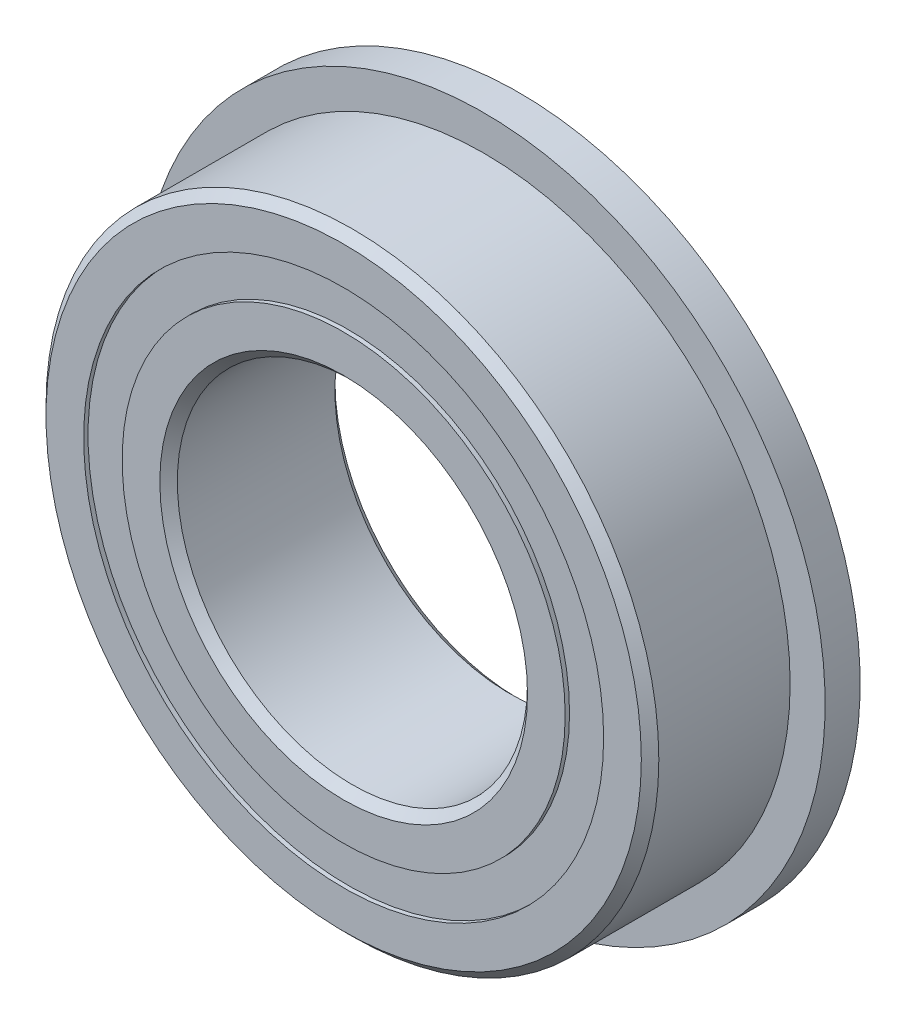
ISO-10303-21;
HEADER;
FILE_DESCRIPTION(('STEP AP214'),'2;1');
FILE_NAME('part.step','',(''),(''),'','','');
FILE_SCHEMA(('AUTOMOTIVE_DESIGN { 1 0 10303 214 1 1 1 1 }'));
ENDSEC;
DATA;
#1=APPLICATION_CONTEXT('core data for automotive mechanical design processes');
#2=APPLICATION_PROTOCOL_DEFINITION('international standard','automotive_design',2000,#1);
#3=PRODUCT_CONTEXT('',#1,'mechanical');
#4=PRODUCT('Part','Part','',(#3));
#5=PRODUCT_RELATED_PRODUCT_CATEGORY('part','',(#4));
#6=PRODUCT_DEFINITION_FORMATION('','',#4);
#7=PRODUCT_DEFINITION_CONTEXT('part definition',#1,'design');
#8=PRODUCT_DEFINITION('design','',#6,#7);
#9=PRODUCT_DEFINITION_SHAPE('','',#8);
#10=(LENGTH_UNIT() NAMED_UNIT(*) SI_UNIT(.MILLI.,.METRE.));
#11=(NAMED_UNIT(*) PLANE_ANGLE_UNIT() SI_UNIT($,.RADIAN.));
#12=(NAMED_UNIT(*) SI_UNIT($,.STERADIAN.) SOLID_ANGLE_UNIT());
#13=UNCERTAINTY_MEASURE_WITH_UNIT(LENGTH_MEASURE(1.E-05),#10,'distance_accuracy_value','');
#14=(GEOMETRIC_REPRESENTATION_CONTEXT(3) GLOBAL_UNCERTAINTY_ASSIGNED_CONTEXT((#13)) GLOBAL_UNIT_ASSIGNED_CONTEXT((#10,
#11,#12)) REPRESENTATION_CONTEXT('',''));
#15=CARTESIAN_POINT('',(0.,0.,0.));
#16=DIRECTION('',(0.,0.,1.));
#17=DIRECTION('',(1.,0.,0.));
#18=AXIS2_PLACEMENT_3D('',#15,#16,#17);
#19=CARTESIAN_POINT('',(0.,5.93956043956044,-1.9));
#20=DIRECTION('',(0.,0.,1.));
#21=DIRECTION('',(1.,0.,0.));
#22=AXIS2_PLACEMENT_3D('',#19,#20,#21);
#23=PLANE('',#22);
#24=CARTESIAN_POINT('',(0.,0.,-1.9));
#25=DIRECTION('',(0.,0.,1.));
#26=DIRECTION('',(1.,0.,0.));
#27=AXIS2_PLACEMENT_3D('',#24,#25,#26);
#28=CIRCLE('',#27,5.93956043956044);
#29=CARTESIAN_POINT('',(5.93956043956044,0.,-1.9));
#30=VERTEX_POINT('',#29);
#31=EDGE_CURVE('E62',#30,#30,#28,.T.);
#32=ORIENTED_EDGE('',*,*,#31,.F.);
#33=EDGE_LOOP('',(#32));
#34=FACE_BOUND('',#33,.T.);
#35=CARTESIAN_POINT('',(0.,0.,-1.9));
#36=DIRECTION('',(0.,0.,1.));
#37=DIRECTION('',(1.,0.,0.));
#38=AXIS2_PLACEMENT_3D('',#35,#36,#37);
#39=CIRCLE('',#38,5.06043956043956);
#40=CARTESIAN_POINT('',(5.06043956043956,0.,-1.9));
#41=VERTEX_POINT('',#40);
#42=EDGE_CURVE('E11',#41,#41,#39,.T.);
#43=ORIENTED_EDGE('',*,*,#42,.T.);
#44=EDGE_LOOP('',(#43));
#45=FACE_BOUND('',#44,.T.);
#46=ADVANCED_FACE('F48',(#34,#45),#23,.F.);
#47=CARTESIAN_POINT('',(0.,0.,2.));
#48=DIRECTION('',(0.,0.,1.));
#49=DIRECTION('',(1.,0.,0.));
#50=AXIS2_PLACEMENT_3D('',#47,#48,#49);
#51=CYLINDRICAL_SURFACE('',#50,5.06043956043956);
#52=ORIENTED_EDGE('',*,*,#42,.F.);
#53=EDGE_LOOP('',(#52));
#54=FACE_BOUND('',#53,.T.);
#55=CARTESIAN_POINT('',(0.,0.,-0.991633418565898));
#56=DIRECTION('',(0.,0.,1.));
#57=DIRECTION('',(1.,0.,0.));
#58=AXIS2_PLACEMENT_3D('',#55,#56,#57);
#59=CIRCLE('',#58,5.06043956043956);
#60=CARTESIAN_POINT('',(5.06043956043956,0.,-0.991633418565898));
#61=VERTEX_POINT('',#60);
#62=EDGE_CURVE('E54',#61,#61,#59,.T.);
#63=ORIENTED_EDGE('',*,*,#62,.T.);
#64=EDGE_LOOP('',(#63));
#65=FACE_BOUND('',#64,.T.);
#66=ADVANCED_FACE('F71',(#54,#65),#51,.F.);
#67=CARTESIAN_POINT('',(0.,5.93956043956044,-0.991633418565898));
#68=DIRECTION('',(0.,0.,-1.));
#69=DIRECTION('',(-1.,0.,0.));
#70=AXIS2_PLACEMENT_3D('',#67,#68,#69);
#71=PLANE('',#70);
#72=ORIENTED_EDGE('',*,*,#62,.F.);
#73=EDGE_LOOP('',(#72));
#74=FACE_BOUND('',#73,.T.);
#75=CARTESIAN_POINT('',(0.,0.,-0.991633418565898));
#76=DIRECTION('',(0.,0.,1.));
#77=DIRECTION('',(1.,0.,0.));
#78=AXIS2_PLACEMENT_3D('',#75,#76,#77);
#79=CIRCLE('',#78,5.93956043956044);
#80=CARTESIAN_POINT('',(5.93956043956044,0.,-0.991633418565898));
#81=VERTEX_POINT('',#80);
#82=EDGE_CURVE('E58',#81,#81,#79,.T.);
#83=ORIENTED_EDGE('',*,*,#82,.T.);
#84=EDGE_LOOP('',(#83));
#85=FACE_BOUND('',#84,.T.);
#86=ADVANCED_FACE('F75',(#74,#85),#71,.F.);
#87=CARTESIAN_POINT('',(0.,0.,2.));
#88=DIRECTION('',(0.,0.,1.));
#89=DIRECTION('',(1.,0.,0.));
#90=AXIS2_PLACEMENT_3D('',#87,#88,#89);
#91=CYLINDRICAL_SURFACE('',#90,5.93956043956044);
#92=ORIENTED_EDGE('',*,*,#82,.F.);
#93=EDGE_LOOP('',(#92));
#94=FACE_BOUND('',#93,.T.);
#95=ORIENTED_EDGE('',*,*,#31,.T.);
#96=EDGE_LOOP('',(#95));
#97=FACE_BOUND('',#96,.T.);
#98=ADVANCED_FACE('F68',(#94,#97),#91,.T.);
#99=CLOSED_SHELL('',(#46,#66,#86,#98));
#100=MANIFOLD_SOLID_BREP('B2',#99);
#101=CARTESIAN_POINT('',(0.,5.93956043956044,1.9));
#102=DIRECTION('',(0.,0.,-1.));
#103=DIRECTION('',(-1.,0.,0.));
#104=AXIS2_PLACEMENT_3D('',#101,#102,#103);
#105=PLANE('',#104);
#106=CARTESIAN_POINT('',(0.,0.,1.9));
#107=DIRECTION('',(0.,0.,1.));
#108=DIRECTION('',(1.,0.,0.));
#109=AXIS2_PLACEMENT_3D('',#106,#107,#108);
#110=CIRCLE('',#109,5.06043956043956);
#111=CARTESIAN_POINT('',(5.06043956043956,0.,1.9));
#112=VERTEX_POINT('',#111);
#113=EDGE_CURVE('E47',#112,#112,#110,.T.);
#114=ORIENTED_EDGE('',*,*,#113,.F.);
#115=EDGE_LOOP('',(#114));
#116=FACE_BOUND('',#115,.T.);
#117=CARTESIAN_POINT('',(0.,0.,1.9));
#118=DIRECTION('',(0.,0.,1.));
#119=DIRECTION('',(1.,0.,0.));
#120=AXIS2_PLACEMENT_3D('',#117,#118,#119);
#121=CIRCLE('',#120,5.93956043956044);
#122=CARTESIAN_POINT('',(5.93956043956044,0.,1.9));
#123=VERTEX_POINT('',#122);
#124=EDGE_CURVE('E130',#123,#123,#121,.T.);
#125=ORIENTED_EDGE('',*,*,#124,.T.);
#126=EDGE_LOOP('',(#125));
#127=FACE_BOUND('',#126,.T.);
#128=ADVANCED_FACE('F116',(#116,#127),#105,.F.);
#129=CARTESIAN_POINT('',(0.,0.,2.));
#130=DIRECTION('',(0.,0.,1.));
#131=DIRECTION('',(1.,0.,0.));
#132=AXIS2_PLACEMENT_3D('',#129,#130,#131);
#133=CYLINDRICAL_SURFACE('',#132,5.06043956043956);
#134=CARTESIAN_POINT('',(0.,0.,0.991633418565898));
#135=DIRECTION('',(0.,0.,1.));
#136=DIRECTION('',(1.,0.,0.));
#137=AXIS2_PLACEMENT_3D('',#134,#135,#136);
#138=CIRCLE('',#137,5.06043956043956);
#139=CARTESIAN_POINT('',(5.06043956043956,0.,0.991633418565898));
#140=VERTEX_POINT('',#139);
#141=EDGE_CURVE('E122',#140,#140,#138,.T.);
#142=ORIENTED_EDGE('',*,*,#141,.F.);
#143=EDGE_LOOP('',(#142));
#144=FACE_BOUND('',#143,.T.);
#145=ORIENTED_EDGE('',*,*,#113,.T.);
#146=EDGE_LOOP('',(#145));
#147=FACE_BOUND('',#146,.T.);
#148=ADVANCED_FACE('F145',(#144,#147),#133,.F.);
#149=CARTESIAN_POINT('',(0.,5.93956043956044,0.991633418565898));
#150=DIRECTION('',(0.,0.,1.));
#151=DIRECTION('',(1.,0.,0.));
#152=AXIS2_PLACEMENT_3D('',#149,#150,#151);
#153=PLANE('',#152);
#154=CARTESIAN_POINT('',(0.,0.,0.991633418565898));
#155=DIRECTION('',(0.,0.,1.));
#156=DIRECTION('',(1.,0.,0.));
#157=AXIS2_PLACEMENT_3D('',#154,#155,#156);
#158=CIRCLE('',#157,5.93956043956044);
#159=CARTESIAN_POINT('',(5.93956043956044,0.,0.991633418565898));
#160=VERTEX_POINT('',#159);
#161=EDGE_CURVE('E126',#160,#160,#158,.T.);
#162=ORIENTED_EDGE('',*,*,#161,.F.);
#163=EDGE_LOOP('',(#162));
#164=FACE_BOUND('',#163,.T.);
#165=ORIENTED_EDGE('',*,*,#141,.T.);
#166=EDGE_LOOP('',(#165));
#167=FACE_BOUND('',#166,.T.);
#168=ADVANCED_FACE('F140',(#164,#167),#153,.F.);
#169=CARTESIAN_POINT('',(0.,0.,2.));
#170=DIRECTION('',(0.,0.,1.));
#171=DIRECTION('',(1.,0.,0.));
#172=AXIS2_PLACEMENT_3D('',#169,#170,#171);
#173=CYLINDRICAL_SURFACE('',#172,5.93956043956044);
#174=ORIENTED_EDGE('',*,*,#124,.F.);
#175=EDGE_LOOP('',(#174));
#176=FACE_BOUND('',#175,.T.);
#177=ORIENTED_EDGE('',*,*,#161,.T.);
#178=EDGE_LOOP('',(#177));
#179=FACE_BOUND('',#178,.T.);
#180=ADVANCED_FACE('F137',(#176,#179),#173,.T.);
#181=CLOSED_SHELL('',(#128,#148,#168,#180));
#182=MANIFOLD_SOLID_BREP('B6',#181);
#183=CARTESIAN_POINT('',(-2.74999999999994,4.76313972081445,0.));
#184=DIRECTION('',(0.,0.,1.));
#185=DIRECTION('',(-0.499999999999989,0.866025403784445,0.));
#186=AXIS2_PLACEMENT_3D('',#183,#184,#185);
#187=SPHERICAL_SURFACE('',#186,0.991633418565898);
#188=CARTESIAN_POINT('',(-2.74999999999994,4.76313972081445,0.991633418565898));
#189=VERTEX_POINT('',#188);
#190=VERTEX_LOOP('',#189);
#191=FACE_BOUND('',#190,.T.);
#192=ADVANCED_FACE('F184',(#191),#187,.T.);
#193=CLOSED_SHELL('',(#192));
#194=MANIFOLD_SOLID_BREP('B42',#193);
#195=CARTESIAN_POINT('',(-4.76313972081438,2.75000000000006,0.));
#196=DIRECTION('',(0.,0.,1.));
#197=DIRECTION('',(-0.866025403784433,0.50000000000001,0.));
#198=AXIS2_PLACEMENT_3D('',#195,#196,#197);
#199=SPHERICAL_SURFACE('',#198,0.991633418565898);
#200=CARTESIAN_POINT('',(-4.76313972081438,2.75000000000006,0.991633418565898));
#201=VERTEX_POINT('',#200);
#202=VERTEX_LOOP('',#201);
#203=FACE_BOUND('',#202,.T.);
#204=ADVANCED_FACE('F205',(#203),#199,.T.);
#205=CLOSED_SHELL('',(#204));
#206=MANIFOLD_SOLID_BREP('B112',#205);
#207=CARTESIAN_POINT('',(-5.5,0.,0.));
#208=DIRECTION('',(0.,0.,1.));
#209=DIRECTION('',(-1.,0.,0.));
#210=AXIS2_PLACEMENT_3D('',#207,#208,#209);
#211=SPHERICAL_SURFACE('',#210,0.991633418565898);
#212=CARTESIAN_POINT('',(-5.5,0.,0.991633418565898));
#213=VERTEX_POINT('',#212);
#214=VERTEX_LOOP('',#213);
#215=FACE_BOUND('',#214,.T.);
#216=ADVANCED_FACE('F226',(#215),#211,.T.);
#217=CLOSED_SHELL('',(#216));
#218=MANIFOLD_SOLID_BREP('B180',#217);
#219=CARTESIAN_POINT('',(-4.76313972081444,-2.74999999999996,0.));
#220=DIRECTION('',(0.,0.,1.));
#221=DIRECTION('',(-0.866025403784443,-0.499999999999992,0.));
#222=AXIS2_PLACEMENT_3D('',#219,#220,#221);
#223=SPHERICAL_SURFACE('',#222,0.991633418565898);
#224=CARTESIAN_POINT('',(-4.76313972081444,-2.74999999999996,0.991633418565898));
#225=VERTEX_POINT('',#224);
#226=VERTEX_LOOP('',#225);
#227=FACE_BOUND('',#226,.T.);
#228=ADVANCED_FACE('F247',(#227),#223,.T.);
#229=CLOSED_SHELL('',(#228));
#230=MANIFOLD_SOLID_BREP('B201',#229);
#231=CARTESIAN_POINT('',(-2.75000000000004,-4.76313972081439,0.));
#232=DIRECTION('',(0.,0.,1.));
#233=DIRECTION('',(-0.500000000000007,-0.866025403784435,0.));
#234=AXIS2_PLACEMENT_3D('',#231,#232,#233);
#235=SPHERICAL_SURFACE('',#234,0.991633418565898);
#236=CARTESIAN_POINT('',(-2.75000000000004,-4.76313972081439,0.991633418565898));
#237=VERTEX_POINT('',#236);
#238=VERTEX_LOOP('',#237);
#239=FACE_BOUND('',#238,.T.);
#240=ADVANCED_FACE('F268',(#239),#235,.T.);
#241=CLOSED_SHELL('',(#240));
#242=MANIFOLD_SOLID_BREP('B222',#241);
#243=CARTESIAN_POINT('',(0.,-5.5,0.));
#244=DIRECTION('',(0.,0.,1.));
#245=DIRECTION('',(0.,-1.,0.));
#246=AXIS2_PLACEMENT_3D('',#243,#244,#245);
#247=SPHERICAL_SURFACE('',#246,0.991633418565898);
#248=CARTESIAN_POINT('',(0.,-5.5,0.991633418565898));
#249=VERTEX_POINT('',#248);
#250=VERTEX_LOOP('',#249);
#251=FACE_BOUND('',#250,.T.);
#252=ADVANCED_FACE('F289',(#251),#247,.T.);
#253=CLOSED_SHELL('',(#252));
#254=MANIFOLD_SOLID_BREP('B243',#253);
#255=CARTESIAN_POINT('',(2.74999999999997,-4.76313972081443,0.));
#256=DIRECTION('',(0.,0.,1.));
#257=DIRECTION('',(0.499999999999995,-0.866025403784442,0.));
#258=AXIS2_PLACEMENT_3D('',#255,#256,#257);
#259=SPHERICAL_SURFACE('',#258,0.991633418565898);
#260=CARTESIAN_POINT('',(2.74999999999997,-4.76313972081443,0.991633418565898));
#261=VERTEX_POINT('',#260);
#262=VERTEX_LOOP('',#261);
#263=FACE_BOUND('',#262,.T.);
#264=ADVANCED_FACE('F310',(#263),#259,.T.);
#265=CLOSED_SHELL('',(#264));
#266=MANIFOLD_SOLID_BREP('B264',#265);
#267=CARTESIAN_POINT('',(4.7631397208144,-2.75000000000002,0.));
#268=DIRECTION('',(0.,0.,1.));
#269=DIRECTION('',(0.866025403784436,-0.500000000000004,0.));
#270=AXIS2_PLACEMENT_3D('',#267,#268,#269);
#271=SPHERICAL_SURFACE('',#270,0.991633418565898);
#272=CARTESIAN_POINT('',(4.7631397208144,-2.75000000000002,0.991633418565898));
#273=VERTEX_POINT('',#272);
#274=VERTEX_LOOP('',#273);
#275=FACE_BOUND('',#274,.T.);
#276=ADVANCED_FACE('F331',(#275),#271,.T.);
#277=CLOSED_SHELL('',(#276));
#278=MANIFOLD_SOLID_BREP('B285',#277);
#279=CARTESIAN_POINT('',(5.5,0.,0.));
#280=DIRECTION('',(0.,0.,1.));
#281=DIRECTION('',(1.,0.,0.));
#282=AXIS2_PLACEMENT_3D('',#279,#280,#281);
#283=SPHERICAL_SURFACE('',#282,0.991633418565898);
#284=CARTESIAN_POINT('',(5.5,0.,0.991633418565898));
#285=VERTEX_POINT('',#284);
#286=VERTEX_LOOP('',#285);
#287=FACE_BOUND('',#286,.T.);
#288=ADVANCED_FACE('F352',(#287),#283,.T.);
#289=CLOSED_SHELL('',(#288));
#290=MANIFOLD_SOLID_BREP('B306',#289);
#291=CARTESIAN_POINT('',(4.76313972081442,2.74999999999999,0.));
#292=DIRECTION('',(0.,0.,1.));
#293=DIRECTION('',(0.86602540378444,0.499999999999998,0.));
#294=AXIS2_PLACEMENT_3D('',#291,#292,#293);
#295=SPHERICAL_SURFACE('',#294,0.991633418565898);
#296=CARTESIAN_POINT('',(4.76313972081442,2.74999999999999,0.991633418565898));
#297=VERTEX_POINT('',#296);
#298=VERTEX_LOOP('',#297);
#299=FACE_BOUND('',#298,.T.);
#300=ADVANCED_FACE('F373',(#299),#295,.T.);
#301=CLOSED_SHELL('',(#300));
#302=MANIFOLD_SOLID_BREP('B327',#301);
#303=CARTESIAN_POINT('',(2.75000000000001,4.76313972081441,0.));
#304=DIRECTION('',(0.,0.,1.));
#305=DIRECTION('',(0.500000000000001,0.866025403784438,0.));
#306=AXIS2_PLACEMENT_3D('',#303,#304,#305);
#307=SPHERICAL_SURFACE('',#306,0.991633418565898);
#308=CARTESIAN_POINT('',(2.75000000000001,4.76313972081441,0.991633418565898));
#309=VERTEX_POINT('',#308);
#310=VERTEX_LOOP('',#309);
#311=FACE_BOUND('',#310,.T.);
#312=ADVANCED_FACE('F394',(#311),#307,.T.);
#313=CLOSED_SHELL('',(#312));
#314=MANIFOLD_SOLID_BREP('B348',#313);
#315=CARTESIAN_POINT('',(0.,5.5,0.));
#316=DIRECTION('',(0.,0.,1.));
#317=DIRECTION('',(0.,1.,0.));
#318=AXIS2_PLACEMENT_3D('',#315,#316,#317);
#319=SPHERICAL_SURFACE('',#318,0.991633418565898);
#320=CARTESIAN_POINT('',(0.,5.5,0.991633418565898));
#321=VERTEX_POINT('',#320);
#322=VERTEX_LOOP('',#321);
#323=FACE_BOUND('',#322,.T.);
#324=ADVANCED_FACE('F417',(#323),#319,.T.);
#325=CLOSED_SHELL('',(#324));
#326=MANIFOLD_SOLID_BREP('B369',#325);
#327=CARTESIAN_POINT('',(0.,5.06043956043956,2.));
#328=DIRECTION('',(0.,0.,-1.));
#329=DIRECTION('',(-1.,0.,0.));
#330=AXIS2_PLACEMENT_3D('',#327,#328,#329);
#331=PLANE('',#330);
#332=CARTESIAN_POINT('',(0.,0.,2.));
#333=DIRECTION('',(0.,0.,1.));
#334=DIRECTION('',(1.,0.,0.));
#335=AXIS2_PLACEMENT_3D('',#332,#333,#334);
#336=CIRCLE('',#335,4.2);
#337=CARTESIAN_POINT('',(4.2,0.,2.));
#338=VERTEX_POINT('',#337);
#339=EDGE_CURVE('E466',#338,#338,#336,.T.);
#340=ORIENTED_EDGE('',*,*,#339,.F.);
#341=EDGE_LOOP('',(#340));
#342=FACE_BOUND('',#341,.T.);
#343=CARTESIAN_POINT('',(0.,0.,2.));
#344=DIRECTION('',(0.,0.,1.));
#345=DIRECTION('',(1.,0.,0.));
#346=AXIS2_PLACEMENT_3D('',#343,#344,#345);
#347=CIRCLE('',#346,5.06043956043956);
#348=CARTESIAN_POINT('',(5.06043956043956,0.,2.));
#349=VERTEX_POINT('',#348);
#350=EDGE_CURVE('E416',#349,#349,#347,.T.);
#351=ORIENTED_EDGE('',*,*,#350,.T.);
#352=EDGE_LOOP('',(#351));
#353=FACE_BOUND('',#352,.T.);
#354=ADVANCED_FACE('F438',(#342,#353),#331,.F.);
#355=CARTESIAN_POINT('',(0.,0.,2.));
#356=DIRECTION('',(0.,0.,1.));
#357=DIRECTION('',(1.,0.,0.));
#358=AXIS2_PLACEMENT_3D('',#355,#356,#357);
#359=CYLINDRICAL_SURFACE('',#358,5.06043956043956);
#360=ORIENTED_EDGE('',*,*,#350,.F.);
#361=EDGE_LOOP('',(#360));
#362=FACE_BOUND('',#361,.T.);
#363=CARTESIAN_POINT('',(0.,0.,0.888888888888889));
#364=DIRECTION('',(0.,0.,1.));
#365=DIRECTION('',(1.,0.,0.));
#366=AXIS2_PLACEMENT_3D('',#363,#364,#365);
#367=CIRCLE('',#366,5.06043956043956);
#368=CARTESIAN_POINT('',(5.06043956043956,0.,0.888888888888889));
#369=VERTEX_POINT('',#368);
#370=EDGE_CURVE('E444',#369,#369,#367,.T.);
#371=ORIENTED_EDGE('',*,*,#370,.T.);
#372=EDGE_LOOP('',(#371));
#373=FACE_BOUND('',#372,.T.);
#374=ADVANCED_FACE('F473',(#362,#373),#359,.T.);
#375=CARTESIAN_POINT('',(0.,0.,0.));
#376=DIRECTION('',(0.,0.,1.));
#377=DIRECTION('',(1.,0.,0.));
#378=AXIS2_PLACEMENT_3D('',#375,#376,#377);
#379=TOROIDAL_SURFACE('',#378,5.5,0.991633418565897);
#380=ORIENTED_EDGE('',*,*,#370,.F.);
#381=EDGE_LOOP('',(#380));
#382=FACE_BOUND('',#381,.T.);
#383=CARTESIAN_POINT('',(0.,0.,-0.88888888888889));
#384=DIRECTION('',(0.,0.,1.));
#385=DIRECTION('',(1.,0.,0.));
#386=AXIS2_PLACEMENT_3D('',#383,#384,#385);
#387=CIRCLE('',#386,5.06043956043956);
#388=CARTESIAN_POINT('',(5.06043956043956,0.,-0.88888888888889));
#389=VERTEX_POINT('',#388);
#390=EDGE_CURVE('E448',#389,#389,#387,.T.);
#391=ORIENTED_EDGE('',*,*,#390,.T.);
#392=EDGE_LOOP('',(#391));
#393=FACE_BOUND('',#392,.T.);
#394=ADVANCED_FACE('F477',(#382,#393),#379,.F.);
#395=CARTESIAN_POINT('',(0.,0.,2.));
#396=DIRECTION('',(0.,0.,1.));
#397=DIRECTION('',(1.,0.,0.));
#398=AXIS2_PLACEMENT_3D('',#395,#396,#397);
#399=CYLINDRICAL_SURFACE('',#398,5.06043956043956);
#400=ORIENTED_EDGE('',*,*,#390,.F.);
#401=EDGE_LOOP('',(#400));
#402=FACE_BOUND('',#401,.T.);
#403=CARTESIAN_POINT('',(0.,0.,-2.));
#404=DIRECTION('',(0.,0.,1.));
#405=DIRECTION('',(1.,0.,0.));
#406=AXIS2_PLACEMENT_3D('',#403,#404,#405);
#407=CIRCLE('',#406,5.06043956043956);
#408=CARTESIAN_POINT('',(5.06043956043956,0.,-2.));
#409=VERTEX_POINT('',#408);
#410=EDGE_CURVE('E452',#409,#409,#407,.T.);
#411=ORIENTED_EDGE('',*,*,#410,.T.);
#412=EDGE_LOOP('',(#411));
#413=FACE_BOUND('',#412,.T.);
#414=ADVANCED_FACE('F482',(#402,#413),#399,.T.);
#415=CARTESIAN_POINT('',(0.,4.2,-2.));
#416=DIRECTION('',(0.,0.,1.));
#417=DIRECTION('',(1.,0.,0.));
#418=AXIS2_PLACEMENT_3D('',#415,#416,#417);
#419=PLANE('',#418);
#420=ORIENTED_EDGE('',*,*,#410,.F.);
#421=EDGE_LOOP('',(#420));
#422=FACE_BOUND('',#421,.T.);
#423=CARTESIAN_POINT('',(0.,0.,-2.));
#424=DIRECTION('',(0.,0.,1.));
#425=DIRECTION('',(1.,0.,0.));
#426=AXIS2_PLACEMENT_3D('',#423,#424,#425);
#427=CIRCLE('',#426,4.2);
#428=CARTESIAN_POINT('',(4.2,0.,-2.));
#429=VERTEX_POINT('',#428);
#430=EDGE_CURVE('E457',#429,#429,#427,.T.);
#431=ORIENTED_EDGE('',*,*,#430,.T.);
#432=EDGE_LOOP('',(#431));
#433=FACE_BOUND('',#432,.T.);
#434=ADVANCED_FACE('F488',(#422,#433),#419,.F.);
#435=CARTESIAN_POINT('',(0.,0.,-1.8));
#436=DIRECTION('',(0.,0.,-1.));
#437=DIRECTION('',(-1.,0.,0.));
#438=AXIS2_PLACEMENT_3D('',#435,#436,#437);
#439=CONICAL_SURFACE('',#438,4.,0.785398163397447);
#440=ORIENTED_EDGE('',*,*,#430,.F.);
#441=EDGE_LOOP('',(#440));
#442=FACE_BOUND('',#441,.T.);
#443=CARTESIAN_POINT('',(0.,0.,-1.8));
#444=DIRECTION('',(0.,0.,1.));
#445=DIRECTION('',(1.,0.,0.));
#446=AXIS2_PLACEMENT_3D('',#443,#444,#445);
#447=CIRCLE('',#446,4.);
#448=CARTESIAN_POINT('',(4.,0.,-1.8));
#449=VERTEX_POINT('',#448);
#450=EDGE_CURVE('E460',#449,#449,#447,.T.);
#451=ORIENTED_EDGE('',*,*,#450,.T.);
#452=EDGE_LOOP('',(#451));
#453=FACE_BOUND('',#452,.T.);
#454=ADVANCED_FACE('F492',(#442,#453),#439,.F.);
#455=CARTESIAN_POINT('',(0.,0.,2.));
#456=DIRECTION('',(0.,0.,1.));
#457=DIRECTION('',(1.,0.,0.));
#458=AXIS2_PLACEMENT_3D('',#455,#456,#457);
#459=CYLINDRICAL_SURFACE('',#458,4.);
#460=ORIENTED_EDGE('',*,*,#450,.F.);
#461=EDGE_LOOP('',(#460));
#462=FACE_BOUND('',#461,.T.);
#463=CARTESIAN_POINT('',(0.,0.,1.8));
#464=DIRECTION('',(0.,0.,1.));
#465=DIRECTION('',(1.,0.,0.));
#466=AXIS2_PLACEMENT_3D('',#463,#464,#465);
#467=CIRCLE('',#466,4.);
#468=CARTESIAN_POINT('',(4.,0.,1.8));
#469=VERTEX_POINT('',#468);
#470=EDGE_CURVE('E463',#469,#469,#467,.T.);
#471=ORIENTED_EDGE('',*,*,#470,.T.);
#472=EDGE_LOOP('',(#471));
#473=FACE_BOUND('',#472,.T.);
#474=ADVANCED_FACE('F496',(#462,#473),#459,.F.);
#475=CARTESIAN_POINT('',(0.,0.,2.));
#476=DIRECTION('',(0.,0.,1.));
#477=DIRECTION('',(1.,0.,0.));
#478=AXIS2_PLACEMENT_3D('',#475,#476,#477);
#479=CONICAL_SURFACE('',#478,4.2,0.785398163397448);
#480=ORIENTED_EDGE('',*,*,#470,.F.);
#481=EDGE_LOOP('',(#480));
#482=FACE_BOUND('',#481,.T.);
#483=ORIENTED_EDGE('',*,*,#339,.T.);
#484=EDGE_LOOP('',(#483));
#485=FACE_BOUND('',#484,.T.);
#486=ADVANCED_FACE('F470',(#482,#485),#479,.F.);
#487=CLOSED_SHELL('',(#354,#374,#394,#414,#434,#454,#474,#486));
#488=MANIFOLD_SOLID_BREP('B390',#487);
#489=CARTESIAN_POINT('',(0.,0.,1.8));
#490=DIRECTION('',(0.,0.,-1.));
#491=DIRECTION('',(-1.,0.,0.));
#492=AXIS2_PLACEMENT_3D('',#489,#490,#491);
#493=CONICAL_SURFACE('',#492,7.,0.785398163397447);
#494=CARTESIAN_POINT('',(0.,0.,2.));
#495=DIRECTION('',(0.,0.,1.));
#496=DIRECTION('',(1.,0.,0.));
#497=AXIS2_PLACEMENT_3D('',#494,#495,#496);
#498=CIRCLE('',#497,6.8);
#499=CARTESIAN_POINT('',(6.8,0.,2.));
#500=VERTEX_POINT('',#499);
#501=EDGE_CURVE('E585',#500,#500,#498,.T.);
#502=ORIENTED_EDGE('',*,*,#501,.F.);
#503=EDGE_LOOP('',(#502));
#504=FACE_BOUND('',#503,.T.);
#505=CARTESIAN_POINT('',(0.,0.,1.8));
#506=DIRECTION('',(0.,0.,1.));
#507=DIRECTION('',(1.,0.,0.));
#508=AXIS2_PLACEMENT_3D('',#505,#506,#507);
#509=CIRCLE('',#508,7.);
#510=CARTESIAN_POINT('',(7.,0.,1.8));
#511=VERTEX_POINT('',#510);
#512=EDGE_CURVE('E437',#511,#511,#509,.T.);
#513=ORIENTED_EDGE('',*,*,#512,.T.);
#514=EDGE_LOOP('',(#513));
#515=FACE_BOUND('',#514,.T.);
#516=ADVANCED_FACE('F563',(#504,#515),#493,.T.);
#517=CARTESIAN_POINT('',(0.,0.,2.));
#518=DIRECTION('',(0.,0.,1.));
#519=DIRECTION('',(1.,0.,0.));
#520=AXIS2_PLACEMENT_3D('',#517,#518,#519);
#521=CYLINDRICAL_SURFACE('',#520,7.);
#522=CARTESIAN_POINT('',(0.,0.,-1.2));
#523=DIRECTION('',(0.,0.,1.));
#524=DIRECTION('',(1.,0.,0.));
#525=AXIS2_PLACEMENT_3D('',#522,#523,#524);
#526=CIRCLE('',#525,7.);
#527=CARTESIAN_POINT('',(7.,0.,-1.2));
#528=VERTEX_POINT('',#527);
#529=EDGE_CURVE('E588',#528,#528,#526,.T.);
#530=ORIENTED_EDGE('',*,*,#529,.T.);
#531=EDGE_LOOP('',(#530));
#532=FACE_BOUND('',#531,.T.);
#533=ORIENTED_EDGE('',*,*,#512,.F.);
#534=EDGE_LOOP('',(#533));
#535=FACE_BOUND('',#534,.T.);
#536=ADVANCED_FACE('F608',(#532,#535),#521,.T.);
#537=CARTESIAN_POINT('',(0.,6.8,-2.));
#538=DIRECTION('',(0.,0.,1.));
#539=DIRECTION('',(1.,0.,0.));
#540=AXIS2_PLACEMENT_3D('',#537,#538,#539);
#541=PLANE('',#540);
#542=CARTESIAN_POINT('',(0.,0.,-2.));
#543=DIRECTION('',(0.,0.,1.));
#544=DIRECTION('',(1.,0.,0.));
#545=AXIS2_PLACEMENT_3D('',#542,#543,#544);
#546=CIRCLE('',#545,5.93956043956044);
#547=CARTESIAN_POINT('',(5.93956043956044,0.,-2.));
#548=VERTEX_POINT('',#547);
#549=EDGE_CURVE('E569',#548,#548,#546,.T.);
#550=ORIENTED_EDGE('',*,*,#549,.T.);
#551=EDGE_LOOP('',(#550));
#552=FACE_BOUND('',#551,.T.);
#553=CARTESIAN_POINT('',(0.,0.,-2.));
#554=DIRECTION('',(0.,0.,-1.));
#555=DIRECTION('',(-1.,0.,0.));
#556=AXIS2_PLACEMENT_3D('',#553,#554,#555);
#557=CIRCLE('',#556,7.8);
#558=CARTESIAN_POINT('',(-7.8,0.,-2.));
#559=VERTEX_POINT('',#558);
#560=EDGE_CURVE('E591',#559,#559,#557,.T.);
#561=ORIENTED_EDGE('',*,*,#560,.T.);
#562=EDGE_LOOP('',(#561));
#563=FACE_BOUND('',#562,.T.);
#564=ADVANCED_FACE('F611',(#552,#563),#541,.F.);
#565=CARTESIAN_POINT('',(0.,0.,2.));
#566=DIRECTION('',(0.,0.,1.));
#567=DIRECTION('',(1.,0.,0.));
#568=AXIS2_PLACEMENT_3D('',#565,#566,#567);
#569=CYLINDRICAL_SURFACE('',#568,5.93956043956044);
#570=CARTESIAN_POINT('',(0.,0.,-0.888888888888889));
#571=DIRECTION('',(0.,0.,1.));
#572=DIRECTION('',(1.,0.,0.));
#573=AXIS2_PLACEMENT_3D('',#570,#571,#572);
#574=CIRCLE('',#573,5.93956043956044);
#575=CARTESIAN_POINT('',(5.93956043956044,0.,-0.888888888888889));
#576=VERTEX_POINT('',#575);
#577=EDGE_CURVE('E573',#576,#576,#574,.T.);
#578=ORIENTED_EDGE('',*,*,#577,.T.);
#579=EDGE_LOOP('',(#578));
#580=FACE_BOUND('',#579,.T.);
#581=ORIENTED_EDGE('',*,*,#549,.F.);
#582=EDGE_LOOP('',(#581));
#583=FACE_BOUND('',#582,.T.);
#584=ADVANCED_FACE('F616',(#580,#583),#569,.F.);
#585=CARTESIAN_POINT('',(0.,0.,0.));
#586=DIRECTION('',(0.,0.,1.));
#587=DIRECTION('',(1.,0.,0.));
#588=AXIS2_PLACEMENT_3D('',#585,#586,#587);
#589=TOROIDAL_SURFACE('',#588,5.5,0.991633418565898);
#590=ORIENTED_EDGE('',*,*,#577,.F.);
#591=EDGE_LOOP('',(#590));
#592=FACE_BOUND('',#591,.T.);
#593=CARTESIAN_POINT('',(0.,0.,0.888888888888889));
#594=DIRECTION('',(0.,0.,1.));
#595=DIRECTION('',(1.,0.,0.));
#596=AXIS2_PLACEMENT_3D('',#593,#594,#595);
#597=CIRCLE('',#596,5.93956043956044);
#598=CARTESIAN_POINT('',(5.93956043956044,0.,0.888888888888889));
#599=VERTEX_POINT('',#598);
#600=EDGE_CURVE('E577',#599,#599,#597,.T.);
#601=ORIENTED_EDGE('',*,*,#600,.T.);
#602=EDGE_LOOP('',(#601));
#603=FACE_BOUND('',#602,.T.);
#604=ADVANCED_FACE('F622',(#592,#603),#589,.F.);
#605=CARTESIAN_POINT('',(0.,0.,2.));
#606=DIRECTION('',(0.,0.,1.));
#607=DIRECTION('',(1.,0.,0.));
#608=AXIS2_PLACEMENT_3D('',#605,#606,#607);
#609=CYLINDRICAL_SURFACE('',#608,5.93956043956044);
#610=ORIENTED_EDGE('',*,*,#600,.F.);
#611=EDGE_LOOP('',(#610));
#612=FACE_BOUND('',#611,.T.);
#613=CARTESIAN_POINT('',(0.,0.,2.));
#614=DIRECTION('',(0.,0.,1.));
#615=DIRECTION('',(1.,0.,0.));
#616=AXIS2_PLACEMENT_3D('',#613,#614,#615);
#617=CIRCLE('',#616,5.93956043956044);
#618=CARTESIAN_POINT('',(5.93956043956044,0.,2.));
#619=VERTEX_POINT('',#618);
#620=EDGE_CURVE('E582',#619,#619,#617,.T.);
#621=ORIENTED_EDGE('',*,*,#620,.T.);
#622=EDGE_LOOP('',(#621));
#623=FACE_BOUND('',#622,.T.);
#624=ADVANCED_FACE('F626',(#612,#623),#609,.F.);
#625=CARTESIAN_POINT('',(0.,6.8,2.));
#626=DIRECTION('',(0.,0.,-1.));
#627=DIRECTION('',(-1.,0.,0.));
#628=AXIS2_PLACEMENT_3D('',#625,#626,#627);
#629=PLANE('',#628);
#630=ORIENTED_EDGE('',*,*,#620,.F.);
#631=EDGE_LOOP('',(#630));
#632=FACE_BOUND('',#631,.T.);
#633=ORIENTED_EDGE('',*,*,#501,.T.);
#634=EDGE_LOOP('',(#633));
#635=FACE_BOUND('',#634,.T.);
#636=ADVANCED_FACE('F604',(#632,#635),#629,.F.);
#637=CARTESIAN_POINT('',(0.,5.93956043956044,-1.2));
#638=DIRECTION('',(0.,0.,1.));
#639=DIRECTION('',(1.,0.,0.));
#640=AXIS2_PLACEMENT_3D('',#637,#638,#639);
#641=PLANE('',#640);
#642=CARTESIAN_POINT('',(0.,0.,-1.2));
#643=DIRECTION('',(0.,0.,-1.));
#644=DIRECTION('',(-1.,0.,0.));
#645=AXIS2_PLACEMENT_3D('',#642,#643,#644);
#646=CIRCLE('',#645,7.8);
#647=CARTESIAN_POINT('',(-7.8,0.,-1.2));
#648=VERTEX_POINT('',#647);
#649=EDGE_CURVE('E594',#648,#648,#646,.T.);
#650=ORIENTED_EDGE('',*,*,#649,.F.);
#651=EDGE_LOOP('',(#650));
#652=FACE_BOUND('',#651,.T.);
#653=ORIENTED_EDGE('',*,*,#529,.F.);
#654=EDGE_LOOP('',(#653));
#655=FACE_BOUND('',#654,.T.);
#656=ADVANCED_FACE('F601',(#652,#655),#641,.T.);
#657=CARTESIAN_POINT('',(0.,0.,-2.));
#658=DIRECTION('',(0.,0.,-1.));
#659=DIRECTION('',(-1.,0.,0.));
#660=AXIS2_PLACEMENT_3D('',#657,#658,#659);
#661=CYLINDRICAL_SURFACE('',#660,7.8);
#662=ORIENTED_EDGE('',*,*,#649,.T.);
#663=EDGE_LOOP('',(#662));
#664=FACE_BOUND('',#663,.T.);
#665=ORIENTED_EDGE('',*,*,#560,.F.);
#666=EDGE_LOOP('',(#665));
#667=FACE_BOUND('',#666,.T.);
#668=ADVANCED_FACE('F598',(#664,#667),#661,.T.);
#669=CLOSED_SHELL('',(#516,#536,#564,#584,#604,#624,#636,#656,#668));
#670=MANIFOLD_SOLID_BREP('B411',#669);
#671=ADVANCED_BREP_SHAPE_REPRESENTATION('',(#18,#100,#182,#194,#206,#218,#230,#242,#254,#266,
#278,#290,#302,#314,#326,#488,#670),#14);
#672=SHAPE_DEFINITION_REPRESENTATION(#9,#671);
ENDSEC;
END-ISO-10303-21;
